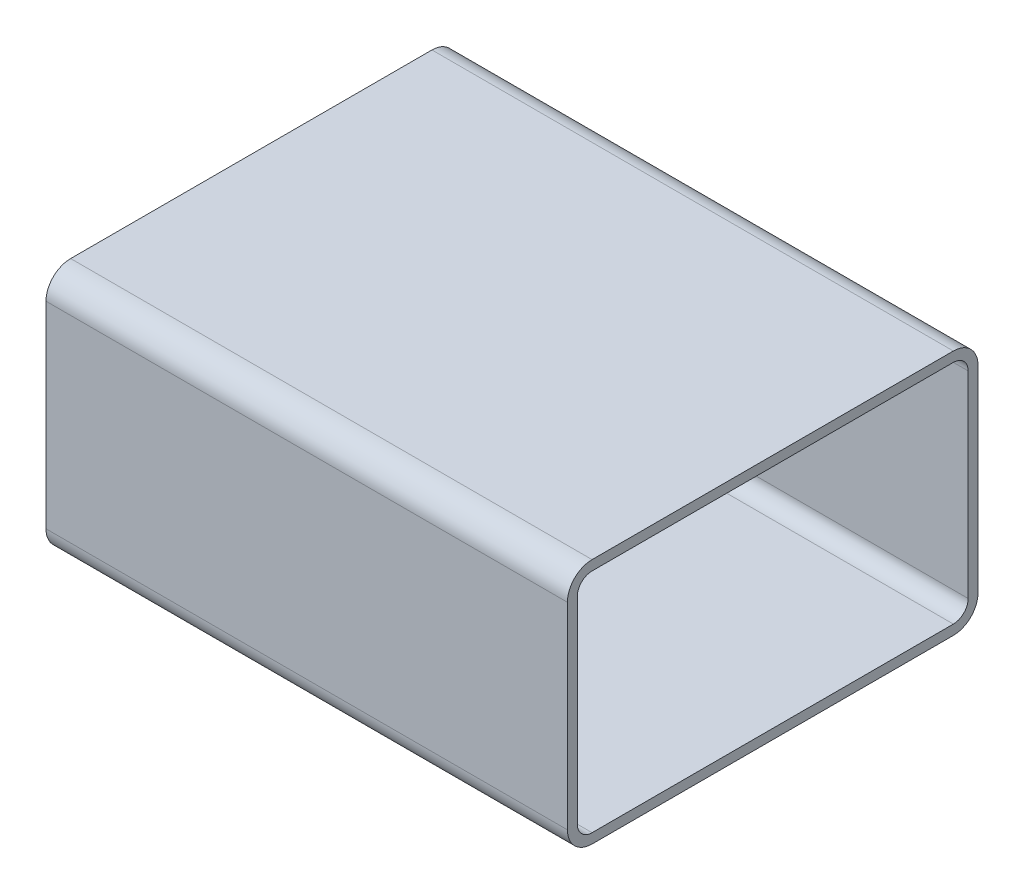
ISO-10303-21;
HEADER;
FILE_DESCRIPTION(('STEP AP214'),'2;1');
FILE_NAME('part.step','',(''),(''),'','','');
FILE_SCHEMA(('AUTOMOTIVE_DESIGN { 1 0 10303 214 1 1 1 1 }'));
ENDSEC;
DATA;
#1=APPLICATION_CONTEXT('core data for automotive mechanical design processes');
#2=APPLICATION_PROTOCOL_DEFINITION('international standard','automotive_design',2000,#1);
#3=PRODUCT_CONTEXT('',#1,'mechanical');
#4=PRODUCT('Part','Part','',(#3));
#5=PRODUCT_RELATED_PRODUCT_CATEGORY('part','',(#4));
#6=PRODUCT_DEFINITION_FORMATION('','',#4);
#7=PRODUCT_DEFINITION_CONTEXT('part definition',#1,'design');
#8=PRODUCT_DEFINITION('design','',#6,#7);
#9=PRODUCT_DEFINITION_SHAPE('','',#8);
#10=(LENGTH_UNIT() NAMED_UNIT(*) SI_UNIT(.MILLI.,.METRE.));
#11=(NAMED_UNIT(*) PLANE_ANGLE_UNIT() SI_UNIT($,.RADIAN.));
#12=(NAMED_UNIT(*) SI_UNIT($,.STERADIAN.) SOLID_ANGLE_UNIT());
#13=UNCERTAINTY_MEASURE_WITH_UNIT(LENGTH_MEASURE(1.E-05),#10,'distance_accuracy_value','');
#14=(GEOMETRIC_REPRESENTATION_CONTEXT(3) GLOBAL_UNCERTAINTY_ASSIGNED_CONTEXT((#13)) GLOBAL_UNIT_ASSIGNED_CONTEXT((#10,
#11,#12)) REPRESENTATION_CONTEXT('',''));
#15=CARTESIAN_POINT('',(0.,0.,0.));
#16=DIRECTION('',(0.,0.,1.));
#17=DIRECTION('',(1.,0.,0.));
#18=AXIS2_PLACEMENT_3D('',#15,#16,#17);
#19=CARTESIAN_POINT('',(63.5,12.,22.));
#20=DIRECTION('',(-1.,0.,0.));
#21=DIRECTION('',(0.,0.,1.));
#22=AXIS2_PLACEMENT_3D('',#19,#20,#21);
#23=CYLINDRICAL_SURFACE('',#22,3.);
#24=CARTESIAN_POINT('',(0.,12.,22.));
#25=DIRECTION('',(1.,0.,0.));
#26=DIRECTION('',(0.,0.,-1.));
#27=AXIS2_PLACEMENT_3D('',#24,#25,#26);
#28=CIRCLE('',#27,3.);
#29=CARTESIAN_POINT('',(0.,15.,22.));
#30=VERTEX_POINT('',#29);
#31=CARTESIAN_POINT('',(0.,12.,25.));
#32=VERTEX_POINT('',#31);
#33=EDGE_CURVE('E256',#30,#32,#28,.T.);
#34=ORIENTED_EDGE('',*,*,#33,.T.);
#35=DIRECTION('',(-1.,0.,0.));
#36=VECTOR('',#35,1.);
#37=CARTESIAN_POINT('',(63.5,12.,25.));
#38=LINE('',#37,#36);
#39=CARTESIAN_POINT('',(63.5,12.,25.));
#40=VERTEX_POINT('',#39);
#41=EDGE_CURVE('E12',#40,#32,#38,.T.);
#42=ORIENTED_EDGE('',*,*,#41,.F.);
#43=CARTESIAN_POINT('',(63.5,12.,22.));
#44=DIRECTION('',(1.,0.,0.));
#45=DIRECTION('',(0.,0.,-1.));
#46=AXIS2_PLACEMENT_3D('',#43,#44,#45);
#47=CIRCLE('',#46,3.);
#48=CARTESIAN_POINT('',(63.5,15.,22.));
#49=VERTEX_POINT('',#48);
#50=EDGE_CURVE('E365',#49,#40,#47,.T.);
#51=ORIENTED_EDGE('',*,*,#50,.F.);
#52=DIRECTION('',(-1.,0.,0.));
#53=VECTOR('',#52,1.);
#54=CARTESIAN_POINT('',(63.5,15.,22.));
#55=LINE('',#54,#53);
#56=EDGE_CURVE('E279',#49,#30,#55,.T.);
#57=ORIENTED_EDGE('',*,*,#56,.T.);
#58=EDGE_LOOP('',(#34,#42,#51,#57));
#59=FACE_BOUND('',#58,.T.);
#60=ADVANCED_FACE('F70',(#59),#23,.T.);
#61=CARTESIAN_POINT('',(63.5,12.,25.));
#62=DIRECTION('',(0.,0.,-1.));
#63=DIRECTION('',(-1.,0.,0.));
#64=AXIS2_PLACEMENT_3D('',#61,#62,#63);
#65=PLANE('',#64);
#66=DIRECTION('',(0.,-1.,0.));
#67=VECTOR('',#66,1.);
#68=CARTESIAN_POINT('',(0.,12.,25.));
#69=LINE('',#68,#67);
#70=CARTESIAN_POINT('',(0.,-12.,25.));
#71=VERTEX_POINT('',#70);
#72=EDGE_CURVE('E260',#32,#71,#69,.T.);
#73=ORIENTED_EDGE('',*,*,#72,.T.);
#74=DIRECTION('',(-1.,0.,0.));
#75=VECTOR('',#74,1.);
#76=CARTESIAN_POINT('',(63.5,-12.,25.));
#77=LINE('',#76,#75);
#78=CARTESIAN_POINT('',(63.5,-12.,25.));
#79=VERTEX_POINT('',#78);
#80=EDGE_CURVE('E81',#79,#71,#77,.T.);
#81=ORIENTED_EDGE('',*,*,#80,.F.);
#82=DIRECTION('',(0.,-1.,0.));
#83=VECTOR('',#82,1.);
#84=CARTESIAN_POINT('',(63.5,12.,25.));
#85=LINE('',#84,#83);
#86=EDGE_CURVE('E368',#40,#79,#85,.T.);
#87=ORIENTED_EDGE('',*,*,#86,.F.);
#88=ORIENTED_EDGE('',*,*,#41,.T.);
#89=EDGE_LOOP('',(#73,#81,#87,#88));
#90=FACE_BOUND('',#89,.T.);
#91=ADVANCED_FACE('F461',(#90),#65,.F.);
#92=CARTESIAN_POINT('',(63.5,-12.,22.));
#93=DIRECTION('',(-1.,0.,0.));
#94=DIRECTION('',(0.,0.,1.));
#95=AXIS2_PLACEMENT_3D('',#92,#93,#94);
#96=CYLINDRICAL_SURFACE('',#95,3.);
#97=CARTESIAN_POINT('',(0.,-12.,22.));
#98=DIRECTION('',(1.,0.,0.));
#99=DIRECTION('',(0.,0.,-1.));
#100=AXIS2_PLACEMENT_3D('',#97,#98,#99);
#101=CIRCLE('',#100,3.);
#102=CARTESIAN_POINT('',(0.,-15.,22.));
#103=VERTEX_POINT('',#102);
#104=EDGE_CURVE('E263',#71,#103,#101,.T.);
#105=ORIENTED_EDGE('',*,*,#104,.T.);
#106=DIRECTION('',(-1.,0.,0.));
#107=VECTOR('',#106,1.);
#108=CARTESIAN_POINT('',(63.5,-15.,22.));
#109=LINE('',#108,#107);
#110=CARTESIAN_POINT('',(63.5,-15.,22.));
#111=VERTEX_POINT('',#110);
#112=EDGE_CURVE('E290',#111,#103,#109,.T.);
#113=ORIENTED_EDGE('',*,*,#112,.F.);
#114=CARTESIAN_POINT('',(63.5,-12.,22.));
#115=DIRECTION('',(1.,0.,0.));
#116=DIRECTION('',(0.,0.,-1.));
#117=AXIS2_PLACEMENT_3D('',#114,#115,#116);
#118=CIRCLE('',#117,3.);
#119=EDGE_CURVE('E371',#79,#111,#118,.T.);
#120=ORIENTED_EDGE('',*,*,#119,.F.);
#121=ORIENTED_EDGE('',*,*,#80,.T.);
#122=EDGE_LOOP('',(#105,#113,#120,#121));
#123=FACE_BOUND('',#122,.T.);
#124=ADVANCED_FACE('F467',(#123),#96,.T.);
#125=CARTESIAN_POINT('',(63.5,-15.,-22.));
#126=DIRECTION('',(0.,1.,0.));
#127=DIRECTION('',(0.,0.,1.));
#128=AXIS2_PLACEMENT_3D('',#125,#126,#127);
#129=PLANE('',#128);
#130=DIRECTION('',(0.,0.,-1.));
#131=VECTOR('',#130,1.);
#132=CARTESIAN_POINT('',(0.,-15.,-22.));
#133=LINE('',#132,#131);
#134=CARTESIAN_POINT('',(0.,-15.,-22.));
#135=VERTEX_POINT('',#134);
#136=EDGE_CURVE('E266',#103,#135,#133,.T.);
#137=ORIENTED_EDGE('',*,*,#136,.T.);
#138=DIRECTION('',(-1.,0.,0.));
#139=VECTOR('',#138,1.);
#140=CARTESIAN_POINT('',(63.5,-15.,-22.));
#141=LINE('',#140,#139);
#142=CARTESIAN_POINT('',(63.5,-15.,-22.));
#143=VERTEX_POINT('',#142);
#144=EDGE_CURVE('E286',#143,#135,#141,.T.);
#145=ORIENTED_EDGE('',*,*,#144,.F.);
#146=DIRECTION('',(0.,0.,-1.));
#147=VECTOR('',#146,1.);
#148=CARTESIAN_POINT('',(63.5,-15.,-22.));
#149=LINE('',#148,#147);
#150=EDGE_CURVE('E374',#111,#143,#149,.T.);
#151=ORIENTED_EDGE('',*,*,#150,.F.);
#152=ORIENTED_EDGE('',*,*,#112,.T.);
#153=EDGE_LOOP('',(#137,#145,#151,#152));
#154=FACE_BOUND('',#153,.T.);
#155=ADVANCED_FACE('F607',(#154),#129,.F.);
#156=CARTESIAN_POINT('',(63.5,-12.,-22.));
#157=DIRECTION('',(-1.,0.,0.));
#158=DIRECTION('',(0.,0.,1.));
#159=AXIS2_PLACEMENT_3D('',#156,#157,#158);
#160=CYLINDRICAL_SURFACE('',#159,3.);
#161=CARTESIAN_POINT('',(0.,-12.,-22.));
#162=DIRECTION('',(1.,0.,0.));
#163=DIRECTION('',(0.,0.,-1.));
#164=AXIS2_PLACEMENT_3D('',#161,#162,#163);
#165=CIRCLE('',#164,3.);
#166=CARTESIAN_POINT('',(0.,-12.,-25.));
#167=VERTEX_POINT('',#166);
#168=EDGE_CURVE('E269',#135,#167,#165,.T.);
#169=ORIENTED_EDGE('',*,*,#168,.T.);
#170=DIRECTION('',(-1.,0.,0.));
#171=VECTOR('',#170,1.);
#172=CARTESIAN_POINT('',(63.5,-12.,-25.));
#173=LINE('',#172,#171);
#174=CARTESIAN_POINT('',(63.5,-12.,-25.));
#175=VERTEX_POINT('',#174);
#176=EDGE_CURVE('E212',#175,#167,#173,.T.);
#177=ORIENTED_EDGE('',*,*,#176,.F.);
#178=CARTESIAN_POINT('',(63.5,-12.,-22.));
#179=DIRECTION('',(1.,0.,0.));
#180=DIRECTION('',(0.,0.,-1.));
#181=AXIS2_PLACEMENT_3D('',#178,#179,#180);
#182=CIRCLE('',#181,3.);
#183=EDGE_CURVE('E201',#143,#175,#182,.T.);
#184=ORIENTED_EDGE('',*,*,#183,.F.);
#185=ORIENTED_EDGE('',*,*,#144,.T.);
#186=EDGE_LOOP('',(#169,#177,#184,#185));
#187=FACE_BOUND('',#186,.T.);
#188=ADVANCED_FACE('F596',(#187),#160,.T.);
#189=CARTESIAN_POINT('',(63.5,-12.,-25.));
#190=DIRECTION('',(0.,0.,1.));
#191=DIRECTION('',(1.,0.,0.));
#192=AXIS2_PLACEMENT_3D('',#189,#190,#191);
#193=PLANE('',#192);
#194=DIRECTION('',(0.,1.,0.));
#195=VECTOR('',#194,1.);
#196=CARTESIAN_POINT('',(0.,-12.,-25.));
#197=LINE('',#196,#195);
#198=CARTESIAN_POINT('',(0.,12.,-25.));
#199=VERTEX_POINT('',#198);
#200=EDGE_CURVE('E210',#167,#199,#197,.T.);
#201=ORIENTED_EDGE('',*,*,#200,.T.);
#202=DIRECTION('',(-1.,0.,0.));
#203=VECTOR('',#202,1.);
#204=CARTESIAN_POINT('',(63.5,12.,-25.));
#205=LINE('',#204,#203);
#206=CARTESIAN_POINT('',(63.5,12.,-25.));
#207=VERTEX_POINT('',#206);
#208=EDGE_CURVE('E207',#207,#199,#205,.T.);
#209=ORIENTED_EDGE('',*,*,#208,.F.);
#210=DIRECTION('',(0.,1.,0.));
#211=VECTOR('',#210,1.);
#212=CARTESIAN_POINT('',(63.5,-12.,-25.));
#213=LINE('',#212,#211);
#214=EDGE_CURVE('E195',#175,#207,#213,.T.);
#215=ORIENTED_EDGE('',*,*,#214,.F.);
#216=ORIENTED_EDGE('',*,*,#176,.T.);
#217=EDGE_LOOP('',(#201,#209,#215,#216));
#218=FACE_BOUND('',#217,.T.);
#219=ADVANCED_FACE('F208',(#218),#193,.F.);
#220=CARTESIAN_POINT('',(63.5,12.,-22.));
#221=DIRECTION('',(-1.,0.,0.));
#222=DIRECTION('',(0.,0.,1.));
#223=AXIS2_PLACEMENT_3D('',#220,#221,#222);
#224=CYLINDRICAL_SURFACE('',#223,3.);
#225=CARTESIAN_POINT('',(0.,12.,-22.));
#226=DIRECTION('',(1.,0.,0.));
#227=DIRECTION('',(0.,0.,-1.));
#228=AXIS2_PLACEMENT_3D('',#225,#226,#227);
#229=CIRCLE('',#228,3.);
#230=CARTESIAN_POINT('',(0.,15.,-22.));
#231=VERTEX_POINT('',#230);
#232=EDGE_CURVE('E143',#199,#231,#229,.T.);
#233=ORIENTED_EDGE('',*,*,#232,.T.);
#234=DIRECTION('',(-1.,0.,0.));
#235=VECTOR('',#234,1.);
#236=CARTESIAN_POINT('',(63.5,15.,-22.));
#237=LINE('',#236,#235);
#238=CARTESIAN_POINT('',(63.5,15.,-22.));
#239=VERTEX_POINT('',#238);
#240=EDGE_CURVE('E213',#239,#231,#237,.T.);
#241=ORIENTED_EDGE('',*,*,#240,.F.);
#242=CARTESIAN_POINT('',(63.5,12.,-22.));
#243=DIRECTION('',(1.,0.,0.));
#244=DIRECTION('',(0.,0.,-1.));
#245=AXIS2_PLACEMENT_3D('',#242,#243,#244);
#246=CIRCLE('',#245,3.);
#247=EDGE_CURVE('E199',#207,#239,#246,.T.);
#248=ORIENTED_EDGE('',*,*,#247,.F.);
#249=ORIENTED_EDGE('',*,*,#208,.T.);
#250=EDGE_LOOP('',(#233,#241,#248,#249));
#251=FACE_BOUND('',#250,.T.);
#252=ADVANCED_FACE('F215',(#251),#224,.T.);
#253=CARTESIAN_POINT('',(63.5,-12.,22.));
#254=DIRECTION('',(-1.,0.,0.));
#255=DIRECTION('',(0.,0.,1.));
#256=AXIS2_PLACEMENT_3D('',#253,#254,#255);
#257=CYLINDRICAL_SURFACE('',#256,1.8);
#258=CARTESIAN_POINT('',(0.,-12.,22.));
#259=DIRECTION('',(1.,0.,0.));
#260=DIRECTION('',(0.,0.,-1.));
#261=AXIS2_PLACEMENT_3D('',#258,#259,#260);
#262=CIRCLE('',#261,1.8);
#263=CARTESIAN_POINT('',(0.,-12.,23.8));
#264=VERTEX_POINT('',#263);
#265=CARTESIAN_POINT('',(0.,-13.8,22.));
#266=VERTEX_POINT('',#265);
#267=EDGE_CURVE('E224',#264,#266,#262,.T.);
#268=ORIENTED_EDGE('',*,*,#267,.F.);
#269=DIRECTION('',(-1.,0.,0.));
#270=VECTOR('',#269,1.);
#271=CARTESIAN_POINT('',(63.5,-12.,23.8));
#272=LINE('',#271,#270);
#273=CARTESIAN_POINT('',(63.5,-12.,23.8));
#274=VERTEX_POINT('',#273);
#275=EDGE_CURVE('E74',#274,#264,#272,.T.);
#276=ORIENTED_EDGE('',*,*,#275,.F.);
#277=CARTESIAN_POINT('',(63.5,-12.,22.));
#278=DIRECTION('',(1.,0.,0.));
#279=DIRECTION('',(0.,0.,-1.));
#280=AXIS2_PLACEMENT_3D('',#277,#278,#279);
#281=CIRCLE('',#280,1.8);
#282=CARTESIAN_POINT('',(63.5,-13.8,22.));
#283=VERTEX_POINT('',#282);
#284=EDGE_CURVE('E278',#274,#283,#281,.T.);
#285=ORIENTED_EDGE('',*,*,#284,.T.);
#286=DIRECTION('',(-1.,0.,0.));
#287=VECTOR('',#286,1.);
#288=CARTESIAN_POINT('',(63.5,-13.8,22.));
#289=LINE('',#288,#287);
#290=EDGE_CURVE('E220',#283,#266,#289,.T.);
#291=ORIENTED_EDGE('',*,*,#290,.T.);
#292=EDGE_LOOP('',(#268,#276,#285,#291));
#293=FACE_BOUND('',#292,.T.);
#294=ADVANCED_FACE('F72',(#293),#257,.F.);
#295=CARTESIAN_POINT('',(63.5,12.,23.8));
#296=DIRECTION('',(0.,0.,-1.));
#297=DIRECTION('',(-1.,0.,0.));
#298=AXIS2_PLACEMENT_3D('',#295,#296,#297);
#299=PLANE('',#298);
#300=DIRECTION('',(0.,-1.,0.));
#301=VECTOR('',#300,1.);
#302=CARTESIAN_POINT('',(0.,12.,23.8));
#303=LINE('',#302,#301);
#304=CARTESIAN_POINT('',(0.,12.,23.8));
#305=VERTEX_POINT('',#304);
#306=EDGE_CURVE('E228',#305,#264,#303,.T.);
#307=ORIENTED_EDGE('',*,*,#306,.F.);
#308=DIRECTION('',(-1.,0.,0.));
#309=VECTOR('',#308,1.);
#310=CARTESIAN_POINT('',(63.5,12.,23.8));
#311=LINE('',#310,#309);
#312=CARTESIAN_POINT('',(63.5,12.,23.8));
#313=VERTEX_POINT('',#312);
#314=EDGE_CURVE('E313',#313,#305,#311,.T.);
#315=ORIENTED_EDGE('',*,*,#314,.F.);
#316=DIRECTION('',(0.,-1.,0.));
#317=VECTOR('',#316,1.);
#318=CARTESIAN_POINT('',(63.5,12.,23.8));
#319=LINE('',#318,#317);
#320=EDGE_CURVE('E326',#313,#274,#319,.T.);
#321=ORIENTED_EDGE('',*,*,#320,.T.);
#322=ORIENTED_EDGE('',*,*,#275,.T.);
#323=EDGE_LOOP('',(#307,#315,#321,#322));
#324=FACE_BOUND('',#323,.T.);
#325=ADVANCED_FACE('F324',(#324),#299,.T.);
#326=CARTESIAN_POINT('',(63.5,12.,22.));
#327=DIRECTION('',(-1.,0.,0.));
#328=DIRECTION('',(0.,0.,1.));
#329=AXIS2_PLACEMENT_3D('',#326,#327,#328);
#330=CYLINDRICAL_SURFACE('',#329,1.8);
#331=CARTESIAN_POINT('',(0.,12.,22.));
#332=DIRECTION('',(1.,0.,0.));
#333=DIRECTION('',(0.,0.,-1.));
#334=AXIS2_PLACEMENT_3D('',#331,#332,#333);
#335=CIRCLE('',#334,1.8);
#336=CARTESIAN_POINT('',(0.,13.8,22.));
#337=VERTEX_POINT('',#336);
#338=EDGE_CURVE('E232',#337,#305,#335,.T.);
#339=ORIENTED_EDGE('',*,*,#338,.F.);
#340=DIRECTION('',(-1.,0.,0.));
#341=VECTOR('',#340,1.);
#342=CARTESIAN_POINT('',(63.5,13.8,22.));
#343=LINE('',#342,#341);
#344=CARTESIAN_POINT('',(63.5,13.8,22.));
#345=VERTEX_POINT('',#344);
#346=EDGE_CURVE('E311',#345,#337,#343,.T.);
#347=ORIENTED_EDGE('',*,*,#346,.F.);
#348=CARTESIAN_POINT('',(63.5,12.,22.));
#349=DIRECTION('',(1.,0.,0.));
#350=DIRECTION('',(0.,0.,-1.));
#351=AXIS2_PLACEMENT_3D('',#348,#349,#350);
#352=CIRCLE('',#351,1.8);
#353=EDGE_CURVE('E334',#345,#313,#352,.T.);
#354=ORIENTED_EDGE('',*,*,#353,.T.);
#355=ORIENTED_EDGE('',*,*,#314,.T.);
#356=EDGE_LOOP('',(#339,#347,#354,#355));
#357=FACE_BOUND('',#356,.T.);
#358=ADVANCED_FACE('F332',(#357),#330,.F.);
#359=CARTESIAN_POINT('',(63.5,13.8,22.));
#360=DIRECTION('',(0.,-1.,0.));
#361=DIRECTION('',(0.,0.,-1.));
#362=AXIS2_PLACEMENT_3D('',#359,#360,#361);
#363=PLANE('',#362);
#364=DIRECTION('',(0.,0.,1.));
#365=VECTOR('',#364,1.);
#366=CARTESIAN_POINT('',(0.,13.8,22.));
#367=LINE('',#366,#365);
#368=CARTESIAN_POINT('',(0.,13.8,-22.));
#369=VERTEX_POINT('',#368);
#370=EDGE_CURVE('E236',#369,#337,#367,.T.);
#371=ORIENTED_EDGE('',*,*,#370,.F.);
#372=DIRECTION('',(-1.,0.,0.));
#373=VECTOR('',#372,1.);
#374=CARTESIAN_POINT('',(63.5,13.8,-22.));
#375=LINE('',#374,#373);
#376=CARTESIAN_POINT('',(63.5,13.8,-22.));
#377=VERTEX_POINT('',#376);
#378=EDGE_CURVE('E308',#377,#369,#375,.T.);
#379=ORIENTED_EDGE('',*,*,#378,.F.);
#380=DIRECTION('',(0.,0.,1.));
#381=VECTOR('',#380,1.);
#382=CARTESIAN_POINT('',(63.5,13.8,22.));
#383=LINE('',#382,#381);
#384=EDGE_CURVE('E340',#377,#345,#383,.T.);
#385=ORIENTED_EDGE('',*,*,#384,.T.);
#386=ORIENTED_EDGE('',*,*,#346,.T.);
#387=EDGE_LOOP('',(#371,#379,#385,#386));
#388=FACE_BOUND('',#387,.T.);
#389=ADVANCED_FACE('F344',(#388),#363,.T.);
#390=CARTESIAN_POINT('',(63.5,12.,-22.));
#391=DIRECTION('',(-1.,0.,0.));
#392=DIRECTION('',(0.,0.,1.));
#393=AXIS2_PLACEMENT_3D('',#390,#391,#392);
#394=CYLINDRICAL_SURFACE('',#393,1.8);
#395=CARTESIAN_POINT('',(0.,12.,-22.));
#396=DIRECTION('',(1.,0.,0.));
#397=DIRECTION('',(0.,0.,-1.));
#398=AXIS2_PLACEMENT_3D('',#395,#396,#397);
#399=CIRCLE('',#398,1.8);
#400=CARTESIAN_POINT('',(0.,12.,-23.8));
#401=VERTEX_POINT('',#400);
#402=EDGE_CURVE('E240',#401,#369,#399,.T.);
#403=ORIENTED_EDGE('',*,*,#402,.F.);
#404=DIRECTION('',(-1.,0.,0.));
#405=VECTOR('',#404,1.);
#406=CARTESIAN_POINT('',(63.5,12.,-23.8));
#407=LINE('',#406,#405);
#408=CARTESIAN_POINT('',(63.5,12.,-23.8));
#409=VERTEX_POINT('',#408);
#410=EDGE_CURVE('E305',#409,#401,#407,.T.);
#411=ORIENTED_EDGE('',*,*,#410,.F.);
#412=CARTESIAN_POINT('',(63.5,12.,-22.));
#413=DIRECTION('',(1.,0.,0.));
#414=DIRECTION('',(0.,0.,-1.));
#415=AXIS2_PLACEMENT_3D('',#412,#413,#414);
#416=CIRCLE('',#415,1.8);
#417=EDGE_CURVE('E346',#409,#377,#416,.T.);
#418=ORIENTED_EDGE('',*,*,#417,.T.);
#419=ORIENTED_EDGE('',*,*,#378,.T.);
#420=EDGE_LOOP('',(#403,#411,#418,#419));
#421=FACE_BOUND('',#420,.T.);
#422=ADVANCED_FACE('F451',(#421),#394,.F.);
#423=CARTESIAN_POINT('',(63.5,-12.,-23.8));
#424=DIRECTION('',(0.,0.,1.));
#425=DIRECTION('',(1.,0.,0.));
#426=AXIS2_PLACEMENT_3D('',#423,#424,#425);
#427=PLANE('',#426);
#428=DIRECTION('',(0.,1.,0.));
#429=VECTOR('',#428,1.);
#430=CARTESIAN_POINT('',(0.,-12.,-23.8));
#431=LINE('',#430,#429);
#432=CARTESIAN_POINT('',(0.,-12.,-23.8));
#433=VERTEX_POINT('',#432);
#434=EDGE_CURVE('E244',#433,#401,#431,.T.);
#435=ORIENTED_EDGE('',*,*,#434,.F.);
#436=DIRECTION('',(-1.,0.,0.));
#437=VECTOR('',#436,1.);
#438=CARTESIAN_POINT('',(63.5,-12.,-23.8));
#439=LINE('',#438,#437);
#440=CARTESIAN_POINT('',(63.5,-12.,-23.8));
#441=VERTEX_POINT('',#440);
#442=EDGE_CURVE('E302',#441,#433,#439,.T.);
#443=ORIENTED_EDGE('',*,*,#442,.F.);
#444=DIRECTION('',(0.,1.,0.));
#445=VECTOR('',#444,1.);
#446=CARTESIAN_POINT('',(63.5,-12.,-23.8));
#447=LINE('',#446,#445);
#448=EDGE_CURVE('E350',#441,#409,#447,.T.);
#449=ORIENTED_EDGE('',*,*,#448,.T.);
#450=ORIENTED_EDGE('',*,*,#410,.T.);
#451=EDGE_LOOP('',(#435,#443,#449,#450));
#452=FACE_BOUND('',#451,.T.);
#453=ADVANCED_FACE('F448',(#452),#427,.T.);
#454=CARTESIAN_POINT('',(63.5,-12.,-22.));
#455=DIRECTION('',(-1.,0.,0.));
#456=DIRECTION('',(0.,0.,1.));
#457=AXIS2_PLACEMENT_3D('',#454,#455,#456);
#458=CYLINDRICAL_SURFACE('',#457,1.8);
#459=CARTESIAN_POINT('',(0.,-12.,-22.));
#460=DIRECTION('',(1.,0.,0.));
#461=DIRECTION('',(0.,0.,-1.));
#462=AXIS2_PLACEMENT_3D('',#459,#460,#461);
#463=CIRCLE('',#462,1.8);
#464=CARTESIAN_POINT('',(0.,-13.8,-22.));
#465=VERTEX_POINT('',#464);
#466=EDGE_CURVE('E248',#465,#433,#463,.T.);
#467=ORIENTED_EDGE('',*,*,#466,.F.);
#468=DIRECTION('',(-1.,0.,0.));
#469=VECTOR('',#468,1.);
#470=CARTESIAN_POINT('',(63.5,-13.8,-22.));
#471=LINE('',#470,#469);
#472=CARTESIAN_POINT('',(63.5,-13.8,-22.));
#473=VERTEX_POINT('',#472);
#474=EDGE_CURVE('E299',#473,#465,#471,.T.);
#475=ORIENTED_EDGE('',*,*,#474,.F.);
#476=CARTESIAN_POINT('',(63.5,-12.,-22.));
#477=DIRECTION('',(1.,0.,0.));
#478=DIRECTION('',(0.,0.,-1.));
#479=AXIS2_PLACEMENT_3D('',#476,#477,#478);
#480=CIRCLE('',#479,1.8);
#481=EDGE_CURVE('E357',#473,#441,#480,.T.);
#482=ORIENTED_EDGE('',*,*,#481,.T.);
#483=ORIENTED_EDGE('',*,*,#442,.T.);
#484=EDGE_LOOP('',(#467,#475,#482,#483));
#485=FACE_BOUND('',#484,.T.);
#486=ADVANCED_FACE('F446',(#485),#458,.F.);
#487=CARTESIAN_POINT('',(63.5,-13.8,-22.));
#488=DIRECTION('',(0.,1.,0.));
#489=DIRECTION('',(0.,0.,1.));
#490=AXIS2_PLACEMENT_3D('',#487,#488,#489);
#491=PLANE('',#490);
#492=DIRECTION('',(0.,0.,-1.));
#493=VECTOR('',#492,1.);
#494=CARTESIAN_POINT('',(0.,-13.8,-22.));
#495=LINE('',#494,#493);
#496=EDGE_CURVE('E252',#266,#465,#495,.T.);
#497=ORIENTED_EDGE('',*,*,#496,.F.);
#498=ORIENTED_EDGE('',*,*,#290,.F.);
#499=DIRECTION('',(0.,0.,-1.));
#500=VECTOR('',#499,1.);
#501=CARTESIAN_POINT('',(63.5,-13.8,-22.));
#502=LINE('',#501,#500);
#503=EDGE_CURVE('E361',#283,#473,#502,.T.);
#504=ORIENTED_EDGE('',*,*,#503,.T.);
#505=ORIENTED_EDGE('',*,*,#474,.T.);
#506=EDGE_LOOP('',(#497,#498,#504,#505));
#507=FACE_BOUND('',#506,.T.);
#508=ADVANCED_FACE('F442',(#507),#491,.T.);
#509=CARTESIAN_POINT('',(63.5,15.,22.));
#510=DIRECTION('',(0.,-1.,0.));
#511=DIRECTION('',(0.,0.,-1.));
#512=AXIS2_PLACEMENT_3D('',#509,#510,#511);
#513=PLANE('',#512);
#514=DIRECTION('',(0.,0.,1.));
#515=VECTOR('',#514,1.);
#516=CARTESIAN_POINT('',(0.,15.,22.));
#517=LINE('',#516,#515);
#518=EDGE_CURVE('E149',#231,#30,#517,.T.);
#519=ORIENTED_EDGE('',*,*,#518,.T.);
#520=ORIENTED_EDGE('',*,*,#56,.F.);
#521=DIRECTION('',(0.,0.,1.));
#522=VECTOR('',#521,1.);
#523=CARTESIAN_POINT('',(63.5,15.,22.));
#524=LINE('',#523,#522);
#525=EDGE_CURVE('E90',#239,#49,#524,.T.);
#526=ORIENTED_EDGE('',*,*,#525,.F.);
#527=ORIENTED_EDGE('',*,*,#240,.T.);
#528=EDGE_LOOP('',(#519,#520,#526,#527));
#529=FACE_BOUND('',#528,.T.);
#530=ADVANCED_FACE('F474',(#529),#513,.F.);
#531=CARTESIAN_POINT('',(63.5,12.,22.));
#532=DIRECTION('',(1.,0.,0.));
#533=DIRECTION('',(0.,0.,-1.));
#534=AXIS2_PLACEMENT_3D('',#531,#532,#533);
#535=PLANE('',#534);
#536=ORIENTED_EDGE('',*,*,#284,.F.);
#537=ORIENTED_EDGE('',*,*,#320,.F.);
#538=ORIENTED_EDGE('',*,*,#353,.F.);
#539=ORIENTED_EDGE('',*,*,#384,.F.);
#540=ORIENTED_EDGE('',*,*,#417,.F.);
#541=ORIENTED_EDGE('',*,*,#448,.F.);
#542=ORIENTED_EDGE('',*,*,#481,.F.);
#543=ORIENTED_EDGE('',*,*,#503,.F.);
#544=EDGE_LOOP('',(#536,#537,#538,#539,#540,#541,#542,#543));
#545=FACE_BOUND('',#544,.T.);
#546=ORIENTED_EDGE('',*,*,#50,.T.);
#547=ORIENTED_EDGE('',*,*,#86,.T.);
#548=ORIENTED_EDGE('',*,*,#119,.T.);
#549=ORIENTED_EDGE('',*,*,#150,.T.);
#550=ORIENTED_EDGE('',*,*,#183,.T.);
#551=ORIENTED_EDGE('',*,*,#214,.T.);
#552=ORIENTED_EDGE('',*,*,#247,.T.);
#553=ORIENTED_EDGE('',*,*,#525,.T.);
#554=EDGE_LOOP('',(#546,#547,#548,#549,#550,#551,#552,#553));
#555=FACE_BOUND('',#554,.T.);
#556=ADVANCED_FACE('F197',(#545,#555),#535,.T.);
#557=CARTESIAN_POINT('',(0.,12.,22.));
#558=DIRECTION('',(1.,0.,0.));
#559=DIRECTION('',(0.,0.,-1.));
#560=AXIS2_PLACEMENT_3D('',#557,#558,#559);
#561=PLANE('',#560);
#562=ORIENTED_EDGE('',*,*,#267,.T.);
#563=ORIENTED_EDGE('',*,*,#496,.T.);
#564=ORIENTED_EDGE('',*,*,#466,.T.);
#565=ORIENTED_EDGE('',*,*,#434,.T.);
#566=ORIENTED_EDGE('',*,*,#402,.T.);
#567=ORIENTED_EDGE('',*,*,#370,.T.);
#568=ORIENTED_EDGE('',*,*,#338,.T.);
#569=ORIENTED_EDGE('',*,*,#306,.T.);
#570=EDGE_LOOP('',(#562,#563,#564,#565,#566,#567,#568,#569));
#571=FACE_BOUND('',#570,.T.);
#572=ORIENTED_EDGE('',*,*,#33,.F.);
#573=ORIENTED_EDGE('',*,*,#518,.F.);
#574=ORIENTED_EDGE('',*,*,#232,.F.);
#575=ORIENTED_EDGE('',*,*,#200,.F.);
#576=ORIENTED_EDGE('',*,*,#168,.F.);
#577=ORIENTED_EDGE('',*,*,#136,.F.);
#578=ORIENTED_EDGE('',*,*,#104,.F.);
#579=ORIENTED_EDGE('',*,*,#72,.F.);
#580=EDGE_LOOP('',(#572,#573,#574,#575,#576,#577,#578,#579));
#581=FACE_BOUND('',#580,.T.);
#582=ADVANCED_FACE('F329',(#571,#581),#561,.F.);
#583=CLOSED_SHELL('',(#60,#91,#124,#155,#188,#219,#252,#294,#325,#358,#389,#422,#453,#486,#508,
#530,#556,#582));
#584=MANIFOLD_SOLID_BREP('B2',#583);
#585=ADVANCED_BREP_SHAPE_REPRESENTATION('',(#18,#584),#14);
#586=SHAPE_DEFINITION_REPRESENTATION(#9,#585);
ENDSEC;
END-ISO-10303-21;
